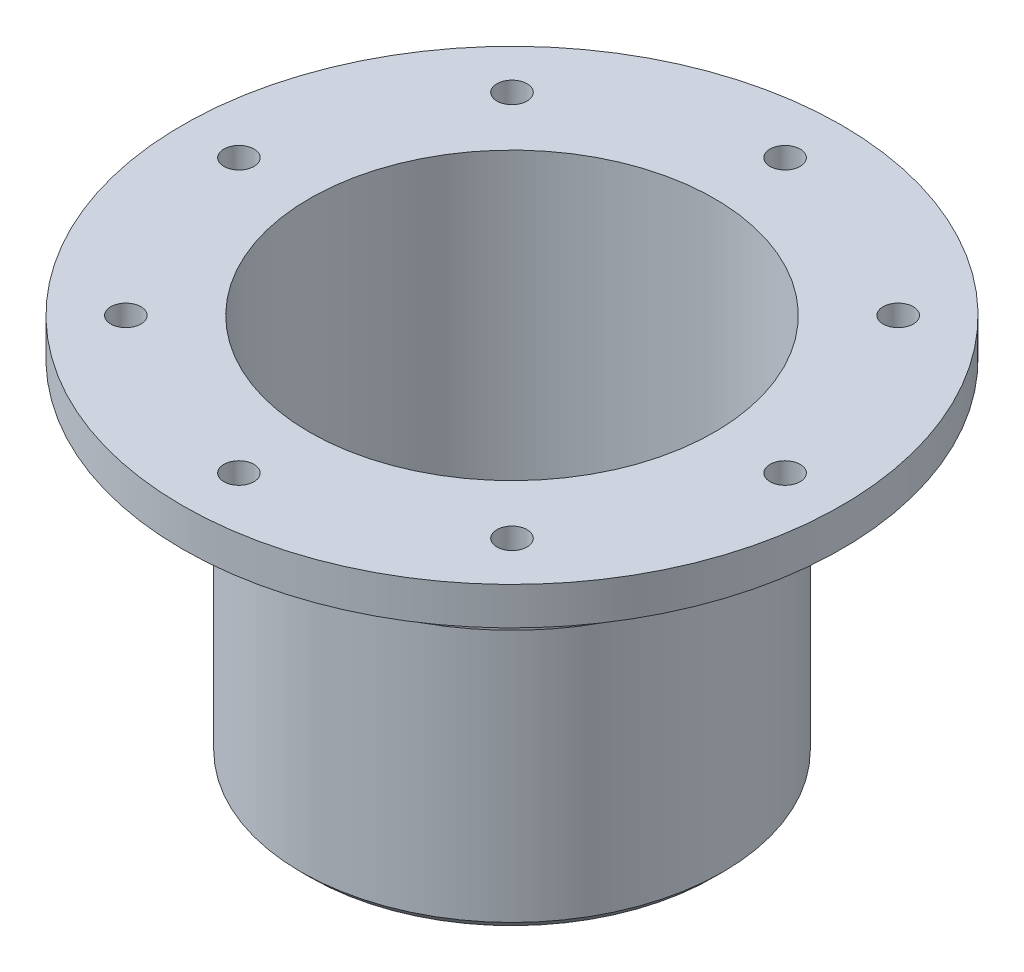
ISO-10303-21;
HEADER;
FILE_DESCRIPTION(('STEP AP214'),'2;1');
FILE_NAME('part.step','',(''),(''),'','','');
FILE_SCHEMA(('AUTOMOTIVE_DESIGN { 1 0 10303 214 1 1 1 1 }'));
ENDSEC;
DATA;
#1=APPLICATION_CONTEXT('core data for automotive mechanical design processes');
#2=APPLICATION_PROTOCOL_DEFINITION('international standard','automotive_design',2000,#1);
#3=PRODUCT_CONTEXT('',#1,'mechanical');
#4=PRODUCT('Part','Part','',(#3));
#5=PRODUCT_RELATED_PRODUCT_CATEGORY('part','',(#4));
#6=PRODUCT_DEFINITION_FORMATION('','',#4);
#7=PRODUCT_DEFINITION_CONTEXT('part definition',#1,'design');
#8=PRODUCT_DEFINITION('design','',#6,#7);
#9=PRODUCT_DEFINITION_SHAPE('','',#8);
#10=(LENGTH_UNIT() NAMED_UNIT(*) SI_UNIT(.MILLI.,.METRE.));
#11=(NAMED_UNIT(*) PLANE_ANGLE_UNIT() SI_UNIT($,.RADIAN.));
#12=(NAMED_UNIT(*) SI_UNIT($,.STERADIAN.) SOLID_ANGLE_UNIT());
#13=UNCERTAINTY_MEASURE_WITH_UNIT(LENGTH_MEASURE(1.E-05),#10,'distance_accuracy_value','');
#14=(GEOMETRIC_REPRESENTATION_CONTEXT(3) GLOBAL_UNCERTAINTY_ASSIGNED_CONTEXT((#13)) GLOBAL_UNIT_ASSIGNED_CONTEXT((#10,
#11,#12)) REPRESENTATION_CONTEXT('',''));
#15=CARTESIAN_POINT('',(0.,0.,0.));
#16=DIRECTION('',(0.,0.,1.));
#17=DIRECTION('',(1.,0.,0.));
#18=AXIS2_PLACEMENT_3D('',#15,#16,#17);
#19=CARTESIAN_POINT('',(0.,34.,0.));
#20=DIRECTION('',(0.,1.,0.));
#21=DIRECTION('',(0.,0.,1.));
#22=AXIS2_PLACEMENT_3D('',#19,#20,#21);
#23=PLANE('',#22);
#24=CARTESIAN_POINT('',(20.5060966544099,34.,-20.5060966544099));
#25=DIRECTION('',(0.,1.,0.));
#26=DIRECTION('',(0.,0.,1.));
#27=AXIS2_PLACEMENT_3D('',#24,#25,#26);
#28=CIRCLE('',#27,1.6);
#29=CARTESIAN_POINT('',(20.5060966544099,34.,-18.9060966544099));
#30=VERTEX_POINT('',#29);
#31=EDGE_CURVE('E151',#30,#30,#28,.T.);
#32=ORIENTED_EDGE('',*,*,#31,.T.);
#33=EDGE_LOOP('',(#32));
#34=FACE_BOUND('',#33,.T.);
#35=CARTESIAN_POINT('',(0.,34.,-29.));
#36=DIRECTION('',(0.,1.,0.));
#37=DIRECTION('',(0.,0.,1.));
#38=AXIS2_PLACEMENT_3D('',#35,#36,#37);
#39=CIRCLE('',#38,1.6);
#40=CARTESIAN_POINT('',(0.,34.,-27.4));
#41=VERTEX_POINT('',#40);
#42=EDGE_CURVE('E145',#41,#41,#39,.T.);
#43=ORIENTED_EDGE('',*,*,#42,.T.);
#44=EDGE_LOOP('',(#43));
#45=FACE_BOUND('',#44,.T.);
#46=CARTESIAN_POINT('',(-20.5060966544099,34.,-20.5060966544099));
#47=DIRECTION('',(0.,1.,0.));
#48=DIRECTION('',(0.,0.,1.));
#49=AXIS2_PLACEMENT_3D('',#46,#47,#48);
#50=CIRCLE('',#49,1.6);
#51=CARTESIAN_POINT('',(-20.5060966544099,34.,-18.9060966544099));
#52=VERTEX_POINT('',#51);
#53=EDGE_CURVE('E139',#52,#52,#50,.T.);
#54=ORIENTED_EDGE('',*,*,#53,.T.);
#55=EDGE_LOOP('',(#54));
#56=FACE_BOUND('',#55,.T.);
#57=CARTESIAN_POINT('',(-29.,34.,0.));
#58=DIRECTION('',(0.,1.,0.));
#59=DIRECTION('',(0.,0.,1.));
#60=AXIS2_PLACEMENT_3D('',#57,#58,#59);
#61=CIRCLE('',#60,1.6);
#62=CARTESIAN_POINT('',(-29.,34.,1.60000000000001));
#63=VERTEX_POINT('',#62);
#64=EDGE_CURVE('E133',#63,#63,#61,.T.);
#65=ORIENTED_EDGE('',*,*,#64,.T.);
#66=EDGE_LOOP('',(#65));
#67=FACE_BOUND('',#66,.T.);
#68=CARTESIAN_POINT('',(-20.5060966544099,34.,20.5060966544099));
#69=DIRECTION('',(0.,1.,0.));
#70=DIRECTION('',(0.,0.,1.));
#71=AXIS2_PLACEMENT_3D('',#68,#69,#70);
#72=CIRCLE('',#71,1.6);
#73=CARTESIAN_POINT('',(-20.5060966544099,34.,22.1060966544099));
#74=VERTEX_POINT('',#73);
#75=EDGE_CURVE('E127',#74,#74,#72,.T.);
#76=ORIENTED_EDGE('',*,*,#75,.T.);
#77=EDGE_LOOP('',(#76));
#78=FACE_BOUND('',#77,.T.);
#79=CARTESIAN_POINT('',(0.,34.,29.));
#80=DIRECTION('',(0.,1.,0.));
#81=DIRECTION('',(0.,0.,1.));
#82=AXIS2_PLACEMENT_3D('',#79,#80,#81);
#83=CIRCLE('',#82,1.6);
#84=CARTESIAN_POINT('',(0.,34.,30.6));
#85=VERTEX_POINT('',#84);
#86=EDGE_CURVE('E121',#85,#85,#83,.T.);
#87=ORIENTED_EDGE('',*,*,#86,.T.);
#88=EDGE_LOOP('',(#87));
#89=FACE_BOUND('',#88,.T.);
#90=CARTESIAN_POINT('',(20.5060966544099,34.,20.5060966544099));
#91=DIRECTION('',(0.,1.,0.));
#92=DIRECTION('',(0.,0.,1.));
#93=AXIS2_PLACEMENT_3D('',#90,#91,#92);
#94=CIRCLE('',#93,1.6);
#95=CARTESIAN_POINT('',(20.5060966544099,34.,22.1060966544099));
#96=VERTEX_POINT('',#95);
#97=EDGE_CURVE('E115',#96,#96,#94,.T.);
#98=ORIENTED_EDGE('',*,*,#97,.T.);
#99=EDGE_LOOP('',(#98));
#100=FACE_BOUND('',#99,.T.);
#101=CARTESIAN_POINT('',(29.,34.,0.));
#102=DIRECTION('',(0.,1.,0.));
#103=DIRECTION('',(0.,0.,1.));
#104=AXIS2_PLACEMENT_3D('',#101,#102,#103);
#105=CIRCLE('',#104,1.60000000000001);
#106=CARTESIAN_POINT('',(29.,34.,1.60000000000001));
#107=VERTEX_POINT('',#106);
#108=EDGE_CURVE('E109',#107,#107,#105,.T.);
#109=ORIENTED_EDGE('',*,*,#108,.T.);
#110=EDGE_LOOP('',(#109));
#111=FACE_BOUND('',#110,.T.);
#112=CARTESIAN_POINT('',(0.,34.,0.));
#113=DIRECTION('',(0.,1.,0.));
#114=DIRECTION('',(0.,0.,1.));
#115=AXIS2_PLACEMENT_3D('',#112,#113,#114);
#116=CIRCLE('',#115,35.);
#117=CARTESIAN_POINT('',(0.,34.,35.));
#118=VERTEX_POINT('',#117);
#119=EDGE_CURVE('E100',#118,#118,#116,.T.);
#120=ORIENTED_EDGE('',*,*,#119,.F.);
#121=EDGE_LOOP('',(#120));
#122=FACE_BOUND('',#121,.T.);
#123=CARTESIAN_POINT('',(0.,34.,0.));
#124=DIRECTION('',(0.,1.,0.));
#125=DIRECTION('',(0.,0.,1.));
#126=AXIS2_PLACEMENT_3D('',#123,#124,#125);
#127=CIRCLE('',#126,24.);
#128=CARTESIAN_POINT('',(0.,34.,24.));
#129=VERTEX_POINT('',#128);
#130=EDGE_CURVE('E61',#129,#129,#127,.F.);
#131=ORIENTED_EDGE('',*,*,#130,.F.);
#132=EDGE_LOOP('',(#131));
#133=FACE_BOUND('',#132,.T.);
#134=ADVANCED_FACE('F45',(#34,#45,#56,#67,#78,#89,#100,#111,#122,#133),#23,.F.);
#135=CARTESIAN_POINT('',(17.5,-3.,0.));
#136=DIRECTION('',(0.,1.,0.));
#137=DIRECTION('',(0.,0.,1.));
#138=AXIS2_PLACEMENT_3D('',#135,#136,#137);
#139=CYLINDRICAL_SURFACE('',#138,2.);
#140=CARTESIAN_POINT('',(17.5,-3.,0.));
#141=DIRECTION('',(0.,1.,0.));
#142=DIRECTION('',(0.,0.,1.));
#143=AXIS2_PLACEMENT_3D('',#140,#141,#142);
#144=CIRCLE('',#143,2.);
#145=CARTESIAN_POINT('',(17.5,-3.,2.));
#146=VERTEX_POINT('',#145);
#147=EDGE_CURVE('E89',#146,#146,#144,.T.);
#148=ORIENTED_EDGE('',*,*,#147,.F.);
#149=EDGE_LOOP('',(#148));
#150=FACE_BOUND('',#149,.T.);
#151=CARTESIAN_POINT('',(17.5,0.,0.));
#152=DIRECTION('',(0.,1.,0.));
#153=DIRECTION('',(0.,0.,1.));
#154=AXIS2_PLACEMENT_3D('',#151,#152,#153);
#155=CIRCLE('',#154,2.);
#156=CARTESIAN_POINT('',(17.5,0.,2.));
#157=VERTEX_POINT('',#156);
#158=EDGE_CURVE('E74',#157,#157,#155,.T.);
#159=ORIENTED_EDGE('',*,*,#158,.T.);
#160=EDGE_LOOP('',(#159));
#161=FACE_BOUND('',#160,.T.);
#162=ADVANCED_FACE('F170',(#150,#161),#139,.F.);
#163=CARTESIAN_POINT('',(0.,-3.,17.5));
#164=DIRECTION('',(0.,1.,0.));
#165=DIRECTION('',(0.,0.,1.));
#166=AXIS2_PLACEMENT_3D('',#163,#164,#165);
#167=CYLINDRICAL_SURFACE('',#166,2.);
#168=CARTESIAN_POINT('',(0.,-3.,17.5));
#169=DIRECTION('',(0.,1.,0.));
#170=DIRECTION('',(0.,0.,1.));
#171=AXIS2_PLACEMENT_3D('',#168,#169,#170);
#172=CIRCLE('',#171,2.);
#173=CARTESIAN_POINT('',(0.,-3.,19.5));
#174=VERTEX_POINT('',#173);
#175=EDGE_CURVE('E92',#174,#174,#172,.T.);
#176=ORIENTED_EDGE('',*,*,#175,.F.);
#177=EDGE_LOOP('',(#176));
#178=FACE_BOUND('',#177,.T.);
#179=CARTESIAN_POINT('',(0.,0.,17.5));
#180=DIRECTION('',(0.,1.,0.));
#181=DIRECTION('',(0.,0.,1.));
#182=AXIS2_PLACEMENT_3D('',#179,#180,#181);
#183=CIRCLE('',#182,2.);
#184=CARTESIAN_POINT('',(0.,0.,19.5));
#185=VERTEX_POINT('',#184);
#186=EDGE_CURVE('E77',#185,#185,#183,.T.);
#187=ORIENTED_EDGE('',*,*,#186,.T.);
#188=EDGE_LOOP('',(#187));
#189=FACE_BOUND('',#188,.T.);
#190=ADVANCED_FACE('F176',(#178,#189),#167,.F.);
#191=CARTESIAN_POINT('',(-17.5,-3.,-1.22189584839116E-13));
#192=DIRECTION('',(0.,1.,0.));
#193=DIRECTION('',(0.,0.,1.));
#194=AXIS2_PLACEMENT_3D('',#191,#192,#193);
#195=CYLINDRICAL_SURFACE('',#194,2.);
#196=CARTESIAN_POINT('',(-17.5,-3.,-1.22189584839116E-13));
#197=DIRECTION('',(0.,1.,0.));
#198=DIRECTION('',(0.,0.,1.));
#199=AXIS2_PLACEMENT_3D('',#196,#197,#198);
#200=CIRCLE('',#199,2.);
#201=CARTESIAN_POINT('',(-17.5,-3.,1.99999999999988));
#202=VERTEX_POINT('',#201);
#203=EDGE_CURVE('E95',#202,#202,#200,.T.);
#204=ORIENTED_EDGE('',*,*,#203,.F.);
#205=EDGE_LOOP('',(#204));
#206=FACE_BOUND('',#205,.T.);
#207=CARTESIAN_POINT('',(-17.5,0.,-1.22189584839116E-13));
#208=DIRECTION('',(0.,1.,0.));
#209=DIRECTION('',(0.,0.,1.));
#210=AXIS2_PLACEMENT_3D('',#207,#208,#209);
#211=CIRCLE('',#210,2.);
#212=CARTESIAN_POINT('',(-17.5,0.,1.99999999999988));
#213=VERTEX_POINT('',#212);
#214=EDGE_CURVE('E80',#213,#213,#211,.T.);
#215=ORIENTED_EDGE('',*,*,#214,.T.);
#216=EDGE_LOOP('',(#215));
#217=FACE_BOUND('',#216,.T.);
#218=ADVANCED_FACE('F207',(#206,#217),#195,.F.);
#219=CARTESIAN_POINT('',(1.8323016715005E-13,-3.,-17.5));
#220=DIRECTION('',(0.,1.,0.));
#221=DIRECTION('',(0.,0.,1.));
#222=AXIS2_PLACEMENT_3D('',#219,#220,#221);
#223=CYLINDRICAL_SURFACE('',#222,2.);
#224=CARTESIAN_POINT('',(1.8323016715005E-13,-3.,-17.5));
#225=DIRECTION('',(0.,1.,0.));
#226=DIRECTION('',(0.,0.,1.));
#227=AXIS2_PLACEMENT_3D('',#224,#225,#226);
#228=CIRCLE('',#227,2.);
#229=CARTESIAN_POINT('',(1.8323016715005E-13,-3.,-15.5));
#230=VERTEX_POINT('',#229);
#231=EDGE_CURVE('E73',#230,#230,#228,.T.);
#232=ORIENTED_EDGE('',*,*,#231,.F.);
#233=EDGE_LOOP('',(#232));
#234=FACE_BOUND('',#233,.T.);
#235=CARTESIAN_POINT('',(1.8323016715005E-13,0.,-17.5));
#236=DIRECTION('',(0.,1.,0.));
#237=DIRECTION('',(0.,0.,1.));
#238=AXIS2_PLACEMENT_3D('',#235,#236,#237);
#239=CIRCLE('',#238,2.);
#240=CARTESIAN_POINT('',(1.8323016715005E-13,0.,-15.5));
#241=VERTEX_POINT('',#240);
#242=EDGE_CURVE('E83',#241,#241,#239,.T.);
#243=ORIENTED_EDGE('',*,*,#242,.T.);
#244=EDGE_LOOP('',(#243));
#245=FACE_BOUND('',#244,.T.);
#246=ADVANCED_FACE('F211',(#234,#245),#223,.F.);
#247=CARTESIAN_POINT('',(0.,-3.,0.));
#248=DIRECTION('',(0.,1.,0.));
#249=DIRECTION('',(0.,0.,1.));
#250=AXIS2_PLACEMENT_3D('',#247,#248,#249);
#251=CYLINDRICAL_SURFACE('',#250,22.4);
#252=CARTESIAN_POINT('',(0.,-2.00000000000002,0.));
#253=DIRECTION('',(0.,1.,0.));
#254=DIRECTION('',(0.,0.,1.));
#255=AXIS2_PLACEMENT_3D('',#252,#253,#254);
#256=CIRCLE('',#255,22.4);
#257=CARTESIAN_POINT('',(0.,-2.00000000000002,22.4));
#258=VERTEX_POINT('',#257);
#259=EDGE_CURVE('E53',#258,#258,#256,.T.);
#260=ORIENTED_EDGE('',*,*,#259,.T.);
#261=EDGE_LOOP('',(#260));
#262=FACE_BOUND('',#261,.T.);
#263=CARTESIAN_POINT('',(0.,26.,0.));
#264=DIRECTION('',(0.,-1.,0.));
#265=DIRECTION('',(0.,0.,-1.));
#266=AXIS2_PLACEMENT_3D('',#263,#264,#265);
#267=CIRCLE('',#266,22.4);
#268=CARTESIAN_POINT('',(0.,26.,-22.4));
#269=VERTEX_POINT('',#268);
#270=EDGE_CURVE('E57',#269,#269,#267,.F.);
#271=ORIENTED_EDGE('',*,*,#270,.F.);
#272=EDGE_LOOP('',(#271));
#273=FACE_BOUND('',#272,.T.);
#274=ADVANCED_FACE('F202',(#262,#273),#251,.T.);
#275=CARTESIAN_POINT('',(0.,-3.,0.));
#276=DIRECTION('',(0.,1.,0.));
#277=DIRECTION('',(0.,0.,1.));
#278=AXIS2_PLACEMENT_3D('',#275,#276,#277);
#279=CYLINDRICAL_SURFACE('',#278,14.);
#280=CARTESIAN_POINT('',(0.,-3.,0.));
#281=DIRECTION('',(0.,1.,0.));
#282=DIRECTION('',(0.,0.,1.));
#283=AXIS2_PLACEMENT_3D('',#280,#281,#282);
#284=CIRCLE('',#283,14.);
#285=CARTESIAN_POINT('',(0.,-3.,14.));
#286=VERTEX_POINT('',#285);
#287=EDGE_CURVE('E69',#286,#286,#284,.T.);
#288=ORIENTED_EDGE('',*,*,#287,.F.);
#289=EDGE_LOOP('',(#288));
#290=FACE_BOUND('',#289,.T.);
#291=CARTESIAN_POINT('',(0.,0.,0.));
#292=DIRECTION('',(0.,1.,0.));
#293=DIRECTION('',(0.,0.,1.));
#294=AXIS2_PLACEMENT_3D('',#291,#292,#293);
#295=CIRCLE('',#294,14.);
#296=CARTESIAN_POINT('',(0.,0.,14.));
#297=VERTEX_POINT('',#296);
#298=EDGE_CURVE('E70',#297,#297,#295,.T.);
#299=ORIENTED_EDGE('',*,*,#298,.T.);
#300=EDGE_LOOP('',(#299));
#301=FACE_BOUND('',#300,.T.);
#302=ADVANCED_FACE('F197',(#290,#301),#279,.F.);
#303=CARTESIAN_POINT('',(0.,-3.,0.));
#304=DIRECTION('',(0.,1.,0.));
#305=DIRECTION('',(0.,0.,1.));
#306=AXIS2_PLACEMENT_3D('',#303,#304,#305);
#307=PLANE('',#306);
#308=CARTESIAN_POINT('',(0.,-3.,0.));
#309=DIRECTION('',(0.,1.,0.));
#310=DIRECTION('',(0.,0.,1.));
#311=AXIS2_PLACEMENT_3D('',#308,#309,#310);
#312=CIRCLE('',#311,21.4);
#313=CARTESIAN_POINT('',(0.,-3.,21.4));
#314=VERTEX_POINT('',#313);
#315=EDGE_CURVE('E10',#314,#314,#312,.F.);
#316=ORIENTED_EDGE('',*,*,#315,.T.);
#317=EDGE_LOOP('',(#316));
#318=FACE_BOUND('',#317,.T.);
#319=ORIENTED_EDGE('',*,*,#231,.T.);
#320=EDGE_LOOP('',(#319));
#321=FACE_BOUND('',#320,.T.);
#322=ORIENTED_EDGE('',*,*,#203,.T.);
#323=EDGE_LOOP('',(#322));
#324=FACE_BOUND('',#323,.T.);
#325=ORIENTED_EDGE('',*,*,#175,.T.);
#326=EDGE_LOOP('',(#325));
#327=FACE_BOUND('',#326,.T.);
#328=ORIENTED_EDGE('',*,*,#147,.T.);
#329=EDGE_LOOP('',(#328));
#330=FACE_BOUND('',#329,.T.);
#331=ORIENTED_EDGE('',*,*,#287,.T.);
#332=EDGE_LOOP('',(#331));
#333=FACE_BOUND('',#332,.T.);
#334=ADVANCED_FACE('F194',(#318,#321,#324,#327,#330,#333),#307,.F.);
#335=CARTESIAN_POINT('',(0.,0.,0.));
#336=DIRECTION('',(0.,1.,0.));
#337=DIRECTION('',(0.,0.,1.));
#338=AXIS2_PLACEMENT_3D('',#335,#336,#337);
#339=PLANE('',#338);
#340=CARTESIAN_POINT('',(0.,0.,0.));
#341=DIRECTION('',(0.,1.,0.));
#342=DIRECTION('',(0.,0.,1.));
#343=AXIS2_PLACEMENT_3D('',#340,#341,#342);
#344=CIRCLE('',#343,21.5);
#345=CARTESIAN_POINT('',(0.,0.,21.5));
#346=VERTEX_POINT('',#345);
#347=EDGE_CURVE('E66',#346,#346,#344,.F.);
#348=ORIENTED_EDGE('',*,*,#347,.F.);
#349=EDGE_LOOP('',(#348));
#350=FACE_BOUND('',#349,.T.);
#351=ORIENTED_EDGE('',*,*,#242,.F.);
#352=EDGE_LOOP('',(#351));
#353=FACE_BOUND('',#352,.T.);
#354=ORIENTED_EDGE('',*,*,#214,.F.);
#355=EDGE_LOOP('',(#354));
#356=FACE_BOUND('',#355,.T.);
#357=ORIENTED_EDGE('',*,*,#186,.F.);
#358=EDGE_LOOP('',(#357));
#359=FACE_BOUND('',#358,.T.);
#360=ORIENTED_EDGE('',*,*,#158,.F.);
#361=EDGE_LOOP('',(#360));
#362=FACE_BOUND('',#361,.T.);
#363=ORIENTED_EDGE('',*,*,#298,.F.);
#364=EDGE_LOOP('',(#363));
#365=FACE_BOUND('',#364,.T.);
#366=ADVANCED_FACE('F192',(#350,#353,#356,#359,#362,#365),#339,.T.);
#367=CARTESIAN_POINT('',(0.,34.,0.));
#368=DIRECTION('',(0.,-1.,0.));
#369=DIRECTION('',(0.,0.,-1.));
#370=AXIS2_PLACEMENT_3D('',#367,#368,#369);
#371=CYLINDRICAL_SURFACE('',#370,21.5);
#372=ORIENTED_EDGE('',*,*,#347,.T.);
#373=EDGE_LOOP('',(#372));
#374=FACE_BOUND('',#373,.T.);
#375=CARTESIAN_POINT('',(0.,38.,0.));
#376=DIRECTION('',(0.,1.,0.));
#377=DIRECTION('',(0.,0.,1.));
#378=AXIS2_PLACEMENT_3D('',#375,#376,#377);
#379=CIRCLE('',#378,21.5);
#380=CARTESIAN_POINT('',(0.,38.,21.5));
#381=VERTEX_POINT('',#380);
#382=EDGE_CURVE('E103',#381,#381,#379,.T.);
#383=ORIENTED_EDGE('',*,*,#382,.T.);
#384=EDGE_LOOP('',(#383));
#385=FACE_BOUND('',#384,.T.);
#386=ADVANCED_FACE('F189',(#374,#385),#371,.F.);
#387=CARTESIAN_POINT('',(0.,38.,0.));
#388=DIRECTION('',(0.,1.,0.));
#389=DIRECTION('',(0.,0.,1.));
#390=AXIS2_PLACEMENT_3D('',#387,#388,#389);
#391=PLANE('',#390);
#392=CARTESIAN_POINT('',(0.,38.,-29.));
#393=DIRECTION('',(0.,1.,0.));
#394=DIRECTION('',(0.,0.,1.));
#395=AXIS2_PLACEMENT_3D('',#392,#393,#394);
#396=CIRCLE('',#395,1.6);
#397=CARTESIAN_POINT('',(0.,38.,-27.4));
#398=VERTEX_POINT('',#397);
#399=EDGE_CURVE('E142',#398,#398,#396,.T.);
#400=ORIENTED_EDGE('',*,*,#399,.F.);
#401=EDGE_LOOP('',(#400));
#402=FACE_BOUND('',#401,.T.);
#403=CARTESIAN_POINT('',(-29.,38.,0.));
#404=DIRECTION('',(0.,1.,0.));
#405=DIRECTION('',(0.,0.,1.));
#406=AXIS2_PLACEMENT_3D('',#403,#404,#405);
#407=CIRCLE('',#406,1.6);
#408=CARTESIAN_POINT('',(-29.,38.,1.60000000000001));
#409=VERTEX_POINT('',#408);
#410=EDGE_CURVE('E130',#409,#409,#407,.T.);
#411=ORIENTED_EDGE('',*,*,#410,.F.);
#412=EDGE_LOOP('',(#411));
#413=FACE_BOUND('',#412,.T.);
#414=CARTESIAN_POINT('',(0.,38.,29.));
#415=DIRECTION('',(0.,1.,0.));
#416=DIRECTION('',(0.,0.,1.));
#417=AXIS2_PLACEMENT_3D('',#414,#415,#416);
#418=CIRCLE('',#417,1.6);
#419=CARTESIAN_POINT('',(0.,38.,30.6));
#420=VERTEX_POINT('',#419);
#421=EDGE_CURVE('E118',#420,#420,#418,.T.);
#422=ORIENTED_EDGE('',*,*,#421,.F.);
#423=EDGE_LOOP('',(#422));
#424=FACE_BOUND('',#423,.T.);
#425=CARTESIAN_POINT('',(29.,38.,0.));
#426=DIRECTION('',(0.,1.,0.));
#427=DIRECTION('',(0.,0.,1.));
#428=AXIS2_PLACEMENT_3D('',#425,#426,#427);
#429=CIRCLE('',#428,1.60000000000001);
#430=CARTESIAN_POINT('',(29.,38.,1.60000000000001));
#431=VERTEX_POINT('',#430);
#432=EDGE_CURVE('E108',#431,#431,#429,.T.);
#433=ORIENTED_EDGE('',*,*,#432,.F.);
#434=EDGE_LOOP('',(#433));
#435=FACE_BOUND('',#434,.T.);
#436=CARTESIAN_POINT('',(0.,38.,0.));
#437=DIRECTION('',(0.,1.,0.));
#438=DIRECTION('',(0.,0.,1.));
#439=AXIS2_PLACEMENT_3D('',#436,#437,#438);
#440=CIRCLE('',#439,35.);
#441=CARTESIAN_POINT('',(0.,38.,35.));
#442=VERTEX_POINT('',#441);
#443=EDGE_CURVE('E86',#442,#442,#440,.T.);
#444=ORIENTED_EDGE('',*,*,#443,.T.);
#445=EDGE_LOOP('',(#444));
#446=FACE_BOUND('',#445,.T.);
#447=ORIENTED_EDGE('',*,*,#382,.F.);
#448=EDGE_LOOP('',(#447));
#449=FACE_BOUND('',#448,.T.);
#450=CARTESIAN_POINT('',(20.5060966544099,38.,20.5060966544099));
#451=DIRECTION('',(0.,1.,0.));
#452=DIRECTION('',(0.,0.,1.));
#453=AXIS2_PLACEMENT_3D('',#450,#451,#452);
#454=CIRCLE('',#453,1.6);
#455=CARTESIAN_POINT('',(20.5060966544099,38.,22.1060966544099));
#456=VERTEX_POINT('',#455);
#457=EDGE_CURVE('E112',#456,#456,#454,.T.);
#458=ORIENTED_EDGE('',*,*,#457,.F.);
#459=EDGE_LOOP('',(#458));
#460=FACE_BOUND('',#459,.T.);
#461=CARTESIAN_POINT('',(-20.5060966544099,38.,20.5060966544099));
#462=DIRECTION('',(0.,1.,0.));
#463=DIRECTION('',(0.,0.,1.));
#464=AXIS2_PLACEMENT_3D('',#461,#462,#463);
#465=CIRCLE('',#464,1.6);
#466=CARTESIAN_POINT('',(-20.5060966544099,38.,22.1060966544099));
#467=VERTEX_POINT('',#466);
#468=EDGE_CURVE('E124',#467,#467,#465,.T.);
#469=ORIENTED_EDGE('',*,*,#468,.F.);
#470=EDGE_LOOP('',(#469));
#471=FACE_BOUND('',#470,.T.);
#472=CARTESIAN_POINT('',(-20.5060966544099,38.,-20.5060966544099));
#473=DIRECTION('',(0.,1.,0.));
#474=DIRECTION('',(0.,0.,1.));
#475=AXIS2_PLACEMENT_3D('',#472,#473,#474);
#476=CIRCLE('',#475,1.6);
#477=CARTESIAN_POINT('',(-20.5060966544099,38.,-18.9060966544099));
#478=VERTEX_POINT('',#477);
#479=EDGE_CURVE('E136',#478,#478,#476,.T.);
#480=ORIENTED_EDGE('',*,*,#479,.F.);
#481=EDGE_LOOP('',(#480));
#482=FACE_BOUND('',#481,.T.);
#483=CARTESIAN_POINT('',(20.5060966544099,38.,-20.5060966544099));
#484=DIRECTION('',(0.,1.,0.));
#485=DIRECTION('',(0.,0.,1.));
#486=AXIS2_PLACEMENT_3D('',#483,#484,#485);
#487=CIRCLE('',#486,1.6);
#488=CARTESIAN_POINT('',(20.5060966544099,38.,-18.9060966544099));
#489=VERTEX_POINT('',#488);
#490=EDGE_CURVE('E148',#489,#489,#487,.T.);
#491=ORIENTED_EDGE('',*,*,#490,.F.);
#492=EDGE_LOOP('',(#491));
#493=FACE_BOUND('',#492,.T.);
#494=ADVANCED_FACE('F182',(#402,#413,#424,#435,#446,#449,#460,#471,#482,#493),#391,.T.);
#495=CARTESIAN_POINT('',(0.,38.,0.));
#496=DIRECTION('',(0.,-1.,0.));
#497=DIRECTION('',(0.,0.,-1.));
#498=AXIS2_PLACEMENT_3D('',#495,#496,#497);
#499=CYLINDRICAL_SURFACE('',#498,35.);
#500=ORIENTED_EDGE('',*,*,#443,.F.);
#501=EDGE_LOOP('',(#500));
#502=FACE_BOUND('',#501,.T.);
#503=ORIENTED_EDGE('',*,*,#119,.T.);
#504=EDGE_LOOP('',(#503));
#505=FACE_BOUND('',#504,.T.);
#506=ADVANCED_FACE('F184',(#502,#505),#499,.T.);
#507=CARTESIAN_POINT('',(29.,38.,0.));
#508=DIRECTION('',(0.,-1.,0.));
#509=DIRECTION('',(0.,0.,-1.));
#510=AXIS2_PLACEMENT_3D('',#507,#508,#509);
#511=CYLINDRICAL_SURFACE('',#510,1.60000000000001);
#512=ORIENTED_EDGE('',*,*,#432,.T.);
#513=EDGE_LOOP('',(#512));
#514=FACE_BOUND('',#513,.T.);
#515=ORIENTED_EDGE('',*,*,#108,.F.);
#516=EDGE_LOOP('',(#515));
#517=FACE_BOUND('',#516,.T.);
#518=ADVANCED_FACE('F187',(#514,#517),#511,.F.);
#519=CARTESIAN_POINT('',(20.5060966544099,38.,20.5060966544099));
#520=DIRECTION('',(0.,-1.,0.));
#521=DIRECTION('',(0.,0.,-1.));
#522=AXIS2_PLACEMENT_3D('',#519,#520,#521);
#523=CYLINDRICAL_SURFACE('',#522,1.6);
#524=ORIENTED_EDGE('',*,*,#457,.T.);
#525=EDGE_LOOP('',(#524));
#526=FACE_BOUND('',#525,.T.);
#527=ORIENTED_EDGE('',*,*,#97,.F.);
#528=EDGE_LOOP('',(#527));
#529=FACE_BOUND('',#528,.T.);
#530=ADVANCED_FACE('F248',(#526,#529),#523,.F.);
#531=CARTESIAN_POINT('',(0.,38.,29.));
#532=DIRECTION('',(0.,-1.,0.));
#533=DIRECTION('',(0.,0.,-1.));
#534=AXIS2_PLACEMENT_3D('',#531,#532,#533);
#535=CYLINDRICAL_SURFACE('',#534,1.6);
#536=ORIENTED_EDGE('',*,*,#421,.T.);
#537=EDGE_LOOP('',(#536));
#538=FACE_BOUND('',#537,.T.);
#539=ORIENTED_EDGE('',*,*,#86,.F.);
#540=EDGE_LOOP('',(#539));
#541=FACE_BOUND('',#540,.T.);
#542=ADVANCED_FACE('F244',(#538,#541),#535,.F.);
#543=CARTESIAN_POINT('',(-20.5060966544099,38.,20.5060966544099));
#544=DIRECTION('',(0.,-1.,0.));
#545=DIRECTION('',(0.,0.,-1.));
#546=AXIS2_PLACEMENT_3D('',#543,#544,#545);
#547=CYLINDRICAL_SURFACE('',#546,1.6);
#548=ORIENTED_EDGE('',*,*,#468,.T.);
#549=EDGE_LOOP('',(#548));
#550=FACE_BOUND('',#549,.T.);
#551=ORIENTED_EDGE('',*,*,#75,.F.);
#552=EDGE_LOOP('',(#551));
#553=FACE_BOUND('',#552,.T.);
#554=ADVANCED_FACE('F240',(#550,#553),#547,.F.);
#555=CARTESIAN_POINT('',(-29.,38.,0.));
#556=DIRECTION('',(0.,-1.,0.));
#557=DIRECTION('',(0.,0.,-1.));
#558=AXIS2_PLACEMENT_3D('',#555,#556,#557);
#559=CYLINDRICAL_SURFACE('',#558,1.6);
#560=ORIENTED_EDGE('',*,*,#410,.T.);
#561=EDGE_LOOP('',(#560));
#562=FACE_BOUND('',#561,.T.);
#563=ORIENTED_EDGE('',*,*,#64,.F.);
#564=EDGE_LOOP('',(#563));
#565=FACE_BOUND('',#564,.T.);
#566=ADVANCED_FACE('F236',(#562,#565),#559,.F.);
#567=CARTESIAN_POINT('',(-20.5060966544099,38.,-20.5060966544099));
#568=DIRECTION('',(0.,-1.,0.));
#569=DIRECTION('',(0.,0.,-1.));
#570=AXIS2_PLACEMENT_3D('',#567,#568,#569);
#571=CYLINDRICAL_SURFACE('',#570,1.6);
#572=ORIENTED_EDGE('',*,*,#479,.T.);
#573=EDGE_LOOP('',(#572));
#574=FACE_BOUND('',#573,.T.);
#575=ORIENTED_EDGE('',*,*,#53,.F.);
#576=EDGE_LOOP('',(#575));
#577=FACE_BOUND('',#576,.T.);
#578=ADVANCED_FACE('F232',(#574,#577),#571,.F.);
#579=CARTESIAN_POINT('',(0.,38.,-29.));
#580=DIRECTION('',(0.,-1.,0.));
#581=DIRECTION('',(0.,0.,-1.));
#582=AXIS2_PLACEMENT_3D('',#579,#580,#581);
#583=CYLINDRICAL_SURFACE('',#582,1.6);
#584=ORIENTED_EDGE('',*,*,#399,.T.);
#585=EDGE_LOOP('',(#584));
#586=FACE_BOUND('',#585,.T.);
#587=ORIENTED_EDGE('',*,*,#42,.F.);
#588=EDGE_LOOP('',(#587));
#589=FACE_BOUND('',#588,.T.);
#590=ADVANCED_FACE('F226',(#586,#589),#583,.F.);
#591=CARTESIAN_POINT('',(20.5060966544099,38.,-20.5060966544099));
#592=DIRECTION('',(0.,-1.,0.));
#593=DIRECTION('',(0.,0.,-1.));
#594=AXIS2_PLACEMENT_3D('',#591,#592,#593);
#595=CYLINDRICAL_SURFACE('',#594,1.6);
#596=ORIENTED_EDGE('',*,*,#490,.T.);
#597=EDGE_LOOP('',(#596));
#598=FACE_BOUND('',#597,.T.);
#599=ORIENTED_EDGE('',*,*,#31,.F.);
#600=EDGE_LOOP('',(#599));
#601=FACE_BOUND('',#600,.T.);
#602=ADVANCED_FACE('F221',(#598,#601),#595,.F.);
#603=CARTESIAN_POINT('',(0.,26.,0.));
#604=DIRECTION('',(0.,-1.,0.));
#605=DIRECTION('',(0.,0.,-1.));
#606=AXIS2_PLACEMENT_3D('',#603,#604,#605);
#607=PLANE('',#606);
#608=CARTESIAN_POINT('',(0.,26.,0.));
#609=DIRECTION('',(0.,-1.,0.));
#610=DIRECTION('',(0.,0.,-1.));
#611=AXIS2_PLACEMENT_3D('',#608,#609,#610);
#612=CIRCLE('',#611,24.);
#613=CARTESIAN_POINT('',(0.,26.,-24.));
#614=VERTEX_POINT('',#613);
#615=EDGE_CURVE('E154',#614,#614,#612,.T.);
#616=ORIENTED_EDGE('',*,*,#615,.T.);
#617=EDGE_LOOP('',(#616));
#618=FACE_BOUND('',#617,.T.);
#619=ORIENTED_EDGE('',*,*,#270,.T.);
#620=EDGE_LOOP('',(#619));
#621=FACE_BOUND('',#620,.T.);
#622=ADVANCED_FACE('F160',(#618,#621),#607,.T.);
#623=CARTESIAN_POINT('',(0.,26.,0.));
#624=DIRECTION('',(0.,1.,0.));
#625=DIRECTION('',(0.,0.,1.));
#626=AXIS2_PLACEMENT_3D('',#623,#624,#625);
#627=CYLINDRICAL_SURFACE('',#626,24.);
#628=ORIENTED_EDGE('',*,*,#615,.F.);
#629=EDGE_LOOP('',(#628));
#630=FACE_BOUND('',#629,.T.);
#631=ORIENTED_EDGE('',*,*,#130,.T.);
#632=EDGE_LOOP('',(#631));
#633=FACE_BOUND('',#632,.T.);
#634=ADVANCED_FACE('F163',(#630,#633),#627,.T.);
#635=CARTESIAN_POINT('',(0.,-2.00000000000002,0.));
#636=DIRECTION('',(0.,1.,0.));
#637=DIRECTION('',(0.,0.,1.));
#638=AXIS2_PLACEMENT_3D('',#635,#636,#637);
#639=CONICAL_SURFACE('',#638,22.4,0.78539816339745);
#640=ORIENTED_EDGE('',*,*,#315,.F.);
#641=EDGE_LOOP('',(#640));
#642=FACE_BOUND('',#641,.T.);
#643=ORIENTED_EDGE('',*,*,#259,.F.);
#644=EDGE_LOOP('',(#643));
#645=FACE_BOUND('',#644,.T.);
#646=ADVANCED_FACE('F48',(#642,#645),#639,.T.);
#647=CLOSED_SHELL('',(#134,#162,#190,#218,#246,#274,#302,#334,#366,#386,#494,#506,#518,#530,
#542,#554,#566,#578,#590,#602,#622,#634,#646));
#648=MANIFOLD_SOLID_BREP('B2',#647);
#649=ADVANCED_BREP_SHAPE_REPRESENTATION('',(#18,#648),#14);
#650=SHAPE_DEFINITION_REPRESENTATION(#9,#649);
ENDSEC;
END-ISO-10303-21;
